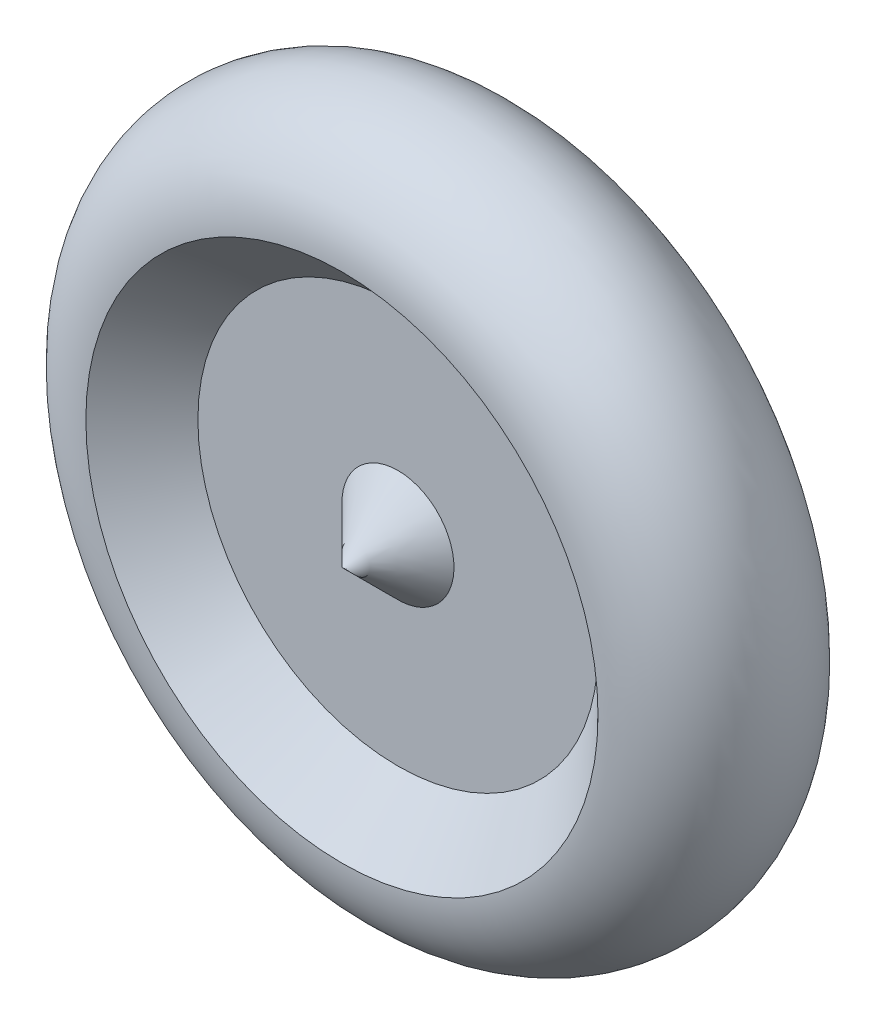
ISO-10303-21;
HEADER;
FILE_DESCRIPTION(('STEP AP214'),'2;1');
FILE_NAME('part.step','',(''),(''),'','','');
FILE_SCHEMA(('AUTOMOTIVE_DESIGN { 1 0 10303 214 1 1 1 1 }'));
ENDSEC;
DATA;
#1=APPLICATION_CONTEXT('core data for automotive mechanical design processes');
#2=APPLICATION_PROTOCOL_DEFINITION('international standard','automotive_design',2000,#1);
#3=PRODUCT_CONTEXT('',#1,'mechanical');
#4=PRODUCT('Part','Part','',(#3));
#5=PRODUCT_RELATED_PRODUCT_CATEGORY('part','',(#4));
#6=PRODUCT_DEFINITION_FORMATION('','',#4);
#7=PRODUCT_DEFINITION_CONTEXT('part definition',#1,'design');
#8=PRODUCT_DEFINITION('design','',#6,#7);
#9=PRODUCT_DEFINITION_SHAPE('','',#8);
#10=(LENGTH_UNIT() NAMED_UNIT(*) SI_UNIT(.MILLI.,.METRE.));
#11=(NAMED_UNIT(*) PLANE_ANGLE_UNIT() SI_UNIT($,.RADIAN.));
#12=(NAMED_UNIT(*) SI_UNIT($,.STERADIAN.) SOLID_ANGLE_UNIT());
#13=UNCERTAINTY_MEASURE_WITH_UNIT(LENGTH_MEASURE(1.E-05),#10,'distance_accuracy_value','');
#14=(GEOMETRIC_REPRESENTATION_CONTEXT(3) GLOBAL_UNCERTAINTY_ASSIGNED_CONTEXT((#13)) GLOBAL_UNIT_ASSIGNED_CONTEXT((#10,
#11,#12)) REPRESENTATION_CONTEXT('',''));
#15=CARTESIAN_POINT('',(0.,0.,0.));
#16=DIRECTION('',(0.,0.,1.));
#17=DIRECTION('',(1.,0.,0.));
#18=AXIS2_PLACEMENT_3D('',#15,#16,#17);
#19=CARTESIAN_POINT('',(0.,0.,12.5));
#20=DIRECTION('',(0.,0.,1.));
#21=DIRECTION('',(0.,-1.,0.));
#22=AXIS2_PLACEMENT_3D('',#19,#20,#21);
#23=CONICAL_SURFACE('',#22,62.5,0.785398163397447);
#24=CARTESIAN_POINT('',(0.,0.,30.));
#25=DIRECTION('',(0.,0.,-1.));
#26=DIRECTION('',(0.,1.,0.));
#27=AXIS2_PLACEMENT_3D('',#24,#25,#26);
#28=CIRCLE('',#27,80.);
#29=CARTESIAN_POINT('',(0.,80.,30.));
#30=VERTEX_POINT('',#29);
#31=EDGE_CURVE('E11',#30,#30,#28,.T.);
#32=ORIENTED_EDGE('',*,*,#31,.F.);
#33=EDGE_LOOP('',(#32));
#34=FACE_BOUND('',#33,.T.);
#35=CARTESIAN_POINT('',(0.,0.,12.5));
#36=DIRECTION('',(0.,0.,-1.));
#37=DIRECTION('',(0.,1.,0.));
#38=AXIS2_PLACEMENT_3D('',#35,#36,#37);
#39=CIRCLE('',#38,62.5);
#40=CARTESIAN_POINT('',(0.,62.5,12.5));
#41=VERTEX_POINT('',#40);
#42=EDGE_CURVE('E87',#41,#41,#39,.T.);
#43=ORIENTED_EDGE('',*,*,#42,.T.);
#44=EDGE_LOOP('',(#43));
#45=FACE_BOUND('',#44,.T.);
#46=ADVANCED_FACE('F45',(#34,#45),#23,.F.);
#47=CARTESIAN_POINT('',(0.,0.,0.));
#48=DIRECTION('',(0.,0.,-1.));
#49=DIRECTION('',(0.,1.,0.));
#50=AXIS2_PLACEMENT_3D('',#47,#48,#49);
#51=TOROIDAL_SURFACE('',#50,80.,30.);
#52=CARTESIAN_POINT('',(0.,0.,-30.));
#53=DIRECTION('',(0.,0.,-1.));
#54=DIRECTION('',(0.,1.,0.));
#55=AXIS2_PLACEMENT_3D('',#52,#53,#54);
#56=CIRCLE('',#55,80.);
#57=CARTESIAN_POINT('',(0.,80.,-30.));
#58=VERTEX_POINT('',#57);
#59=EDGE_CURVE('E53',#58,#58,#56,.T.);
#60=ORIENTED_EDGE('',*,*,#59,.F.);
#61=EDGE_LOOP('',(#60));
#62=FACE_BOUND('',#61,.T.);
#63=ORIENTED_EDGE('',*,*,#31,.T.);
#64=EDGE_LOOP('',(#63));
#65=FACE_BOUND('',#64,.T.);
#66=ADVANCED_FACE('F77',(#62,#65),#51,.T.);
#67=CARTESIAN_POINT('',(0.,0.,-12.5));
#68=DIRECTION('',(0.,0.,-1.));
#69=DIRECTION('',(0.,1.,0.));
#70=AXIS2_PLACEMENT_3D('',#67,#68,#69);
#71=CONICAL_SURFACE('',#70,62.5,0.785398163397448);
#72=ORIENTED_EDGE('',*,*,#59,.T.);
#73=EDGE_LOOP('',(#72));
#74=FACE_BOUND('',#73,.T.);
#75=CARTESIAN_POINT('',(0.,0.,-12.5));
#76=DIRECTION('',(0.,0.,-1.));
#77=DIRECTION('',(0.,1.,0.));
#78=AXIS2_PLACEMENT_3D('',#75,#76,#77);
#79=CIRCLE('',#78,62.5);
#80=CARTESIAN_POINT('',(0.,62.5,-12.5));
#81=VERTEX_POINT('',#80);
#82=EDGE_CURVE('E99',#81,#81,#79,.T.);
#83=ORIENTED_EDGE('',*,*,#82,.F.);
#84=EDGE_LOOP('',(#83));
#85=FACE_BOUND('',#84,.T.);
#86=ADVANCED_FACE('F72',(#74,#85),#71,.F.);
#87=CARTESIAN_POINT('',(0.,17.5,-12.5));
#88=DIRECTION('',(0.,0.,-1.));
#89=DIRECTION('',(0.,1.,0.));
#90=AXIS2_PLACEMENT_3D('',#87,#88,#89);
#91=PLANE('',#90);
#92=ORIENTED_EDGE('',*,*,#82,.T.);
#93=EDGE_LOOP('',(#92));
#94=FACE_BOUND('',#93,.T.);
#95=CARTESIAN_POINT('',(0.,0.,-12.5));
#96=DIRECTION('',(0.,0.,-1.));
#97=DIRECTION('',(0.,1.,0.));
#98=AXIS2_PLACEMENT_3D('',#95,#96,#97);
#99=CIRCLE('',#98,17.5);
#100=CARTESIAN_POINT('',(0.,17.5,-12.5));
#101=VERTEX_POINT('',#100);
#102=EDGE_CURVE('E94',#101,#101,#99,.T.);
#103=ORIENTED_EDGE('',*,*,#102,.F.);
#104=EDGE_LOOP('',(#103));
#105=FACE_BOUND('',#104,.T.);
#106=ADVANCED_FACE('F62',(#94,#105),#91,.T.);
#107=CARTESIAN_POINT('',(0.,0.,-30.));
#108=DIRECTION('',(0.,0.,1.));
#109=DIRECTION('',(0.,-1.,0.));
#110=AXIS2_PLACEMENT_3D('',#107,#108,#109);
#111=CONICAL_SURFACE('',#110,0.,0.785398163397449);
#112=ORIENTED_EDGE('',*,*,#102,.T.);
#113=EDGE_LOOP('',(#112));
#114=FACE_BOUND('',#113,.T.);
#115=CARTESIAN_POINT('',(0.,0.,-30.));
#116=VERTEX_POINT('',#115);
#117=VERTEX_LOOP('',#116);
#118=FACE_BOUND('',#117,.T.);
#119=ADVANCED_FACE('F59',(#114,#118),#111,.T.);
#120=CARTESIAN_POINT('',(0.,0.,30.));
#121=DIRECTION('',(0.,0.,-1.));
#122=DIRECTION('',(0.,1.,0.));
#123=AXIS2_PLACEMENT_3D('',#120,#121,#122);
#124=CONICAL_SURFACE('',#123,0.,0.785398163397449);
#125=CARTESIAN_POINT('',(0.,0.,12.5));
#126=DIRECTION('',(0.,0.,-1.));
#127=DIRECTION('',(0.,1.,0.));
#128=AXIS2_PLACEMENT_3D('',#125,#126,#127);
#129=CIRCLE('',#128,17.5);
#130=CARTESIAN_POINT('',(0.,17.5,12.5));
#131=VERTEX_POINT('',#130);
#132=EDGE_CURVE('E90',#131,#131,#129,.T.);
#133=ORIENTED_EDGE('',*,*,#132,.F.);
#134=EDGE_LOOP('',(#133));
#135=FACE_BOUND('',#134,.T.);
#136=CARTESIAN_POINT('',(0.,0.,30.));
#137=VERTEX_POINT('',#136);
#138=VERTEX_LOOP('',#137);
#139=FACE_BOUND('',#138,.T.);
#140=ADVANCED_FACE('F61',(#135,#139),#124,.T.);
#141=CARTESIAN_POINT('',(0.,17.5,12.5));
#142=DIRECTION('',(0.,0.,-1.));
#143=DIRECTION('',(0.,1.,0.));
#144=AXIS2_PLACEMENT_3D('',#141,#142,#143);
#145=PLANE('',#144);
#146=ORIENTED_EDGE('',*,*,#42,.F.);
#147=EDGE_LOOP('',(#146));
#148=FACE_BOUND('',#147,.T.);
#149=ORIENTED_EDGE('',*,*,#132,.T.);
#150=EDGE_LOOP('',(#149));
#151=FACE_BOUND('',#150,.T.);
#152=ADVANCED_FACE('F69',(#148,#151),#145,.F.);
#153=CLOSED_SHELL('',(#46,#66,#86,#106,#119,#140,#152));
#154=MANIFOLD_SOLID_BREP('B2',#153);
#155=ADVANCED_BREP_SHAPE_REPRESENTATION('',(#18,#154),#14);
#156=SHAPE_DEFINITION_REPRESENTATION(#9,#155);
ENDSEC;
END-ISO-10303-21;
